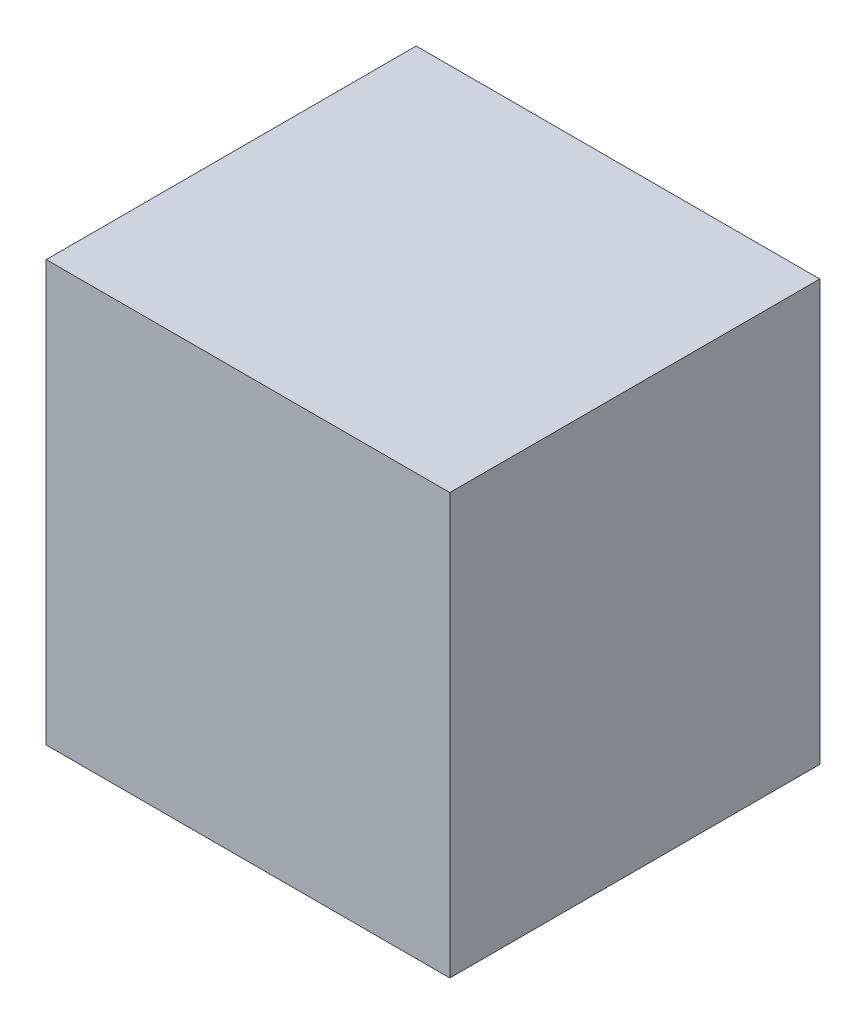
ISO-10303-21;
HEADER;
FILE_DESCRIPTION(('STEP AP214'),'2;1');
FILE_NAME('part.step','',(''),(''),'','','');
FILE_SCHEMA(('AUTOMOTIVE_DESIGN { 1 0 10303 214 1 1 1 1 }'));
ENDSEC;
DATA;
#1=APPLICATION_CONTEXT('core data for automotive mechanical design processes');
#2=APPLICATION_PROTOCOL_DEFINITION('international standard','automotive_design',2000,#1);
#3=PRODUCT_CONTEXT('',#1,'mechanical');
#4=PRODUCT('Part','Part','',(#3));
#5=PRODUCT_RELATED_PRODUCT_CATEGORY('part','',(#4));
#6=PRODUCT_DEFINITION_FORMATION('','',#4);
#7=PRODUCT_DEFINITION_CONTEXT('part definition',#1,'design');
#8=PRODUCT_DEFINITION('design','',#6,#7);
#9=PRODUCT_DEFINITION_SHAPE('','',#8);
#10=(LENGTH_UNIT() NAMED_UNIT(*) SI_UNIT(.MILLI.,.METRE.));
#11=(NAMED_UNIT(*) PLANE_ANGLE_UNIT() SI_UNIT($,.RADIAN.));
#12=(NAMED_UNIT(*) SI_UNIT($,.STERADIAN.) SOLID_ANGLE_UNIT());
#13=UNCERTAINTY_MEASURE_WITH_UNIT(LENGTH_MEASURE(1.E-05),#10,'distance_accuracy_value','');
#14=(GEOMETRIC_REPRESENTATION_CONTEXT(3) GLOBAL_UNCERTAINTY_ASSIGNED_CONTEXT((#13)) GLOBAL_UNIT_ASSIGNED_CONTEXT((#10,
#11,#12)) REPRESENTATION_CONTEXT('',''));
#15=CARTESIAN_POINT('',(0.,0.,0.));
#16=DIRECTION('',(0.,0.,1.));
#17=DIRECTION('',(1.,0.,0.));
#18=AXIS2_PLACEMENT_3D('',#15,#16,#17);
#19=CARTESIAN_POINT('',(0.,79.375,0.));
#20=DIRECTION('',(1.,0.,0.));
#21=DIRECTION('',(0.,0.,-1.));
#22=AXIS2_PLACEMENT_3D('',#19,#20,#21);
#23=PLANE('',#22);
#24=DIRECTION('',(0.,0.,1.));
#25=VECTOR('',#24,1.);
#26=CARTESIAN_POINT('',(0.,0.,0.));
#27=LINE('',#26,#25);
#28=CARTESIAN_POINT('',(0.,0.,-69.85));
#29=VERTEX_POINT('',#28);
#30=CARTESIAN_POINT('',(0.,0.,0.));
#31=VERTEX_POINT('',#30);
#32=EDGE_CURVE('E96',#29,#31,#27,.T.);
#33=ORIENTED_EDGE('',*,*,#32,.T.);
#34=DIRECTION('',(0.,-1.,0.));
#35=VECTOR('',#34,1.);
#36=CARTESIAN_POINT('',(0.,79.375,0.));
#37=LINE('',#36,#35);
#38=CARTESIAN_POINT('',(0.,79.375,0.));
#39=VERTEX_POINT('',#38);
#40=EDGE_CURVE('E11',#39,#31,#37,.T.);
#41=ORIENTED_EDGE('',*,*,#40,.F.);
#42=DIRECTION('',(0.,0.,1.));
#43=VECTOR('',#42,1.);
#44=CARTESIAN_POINT('',(0.,79.375,0.));
#45=LINE('',#44,#43);
#46=CARTESIAN_POINT('',(0.,79.375,-69.85));
#47=VERTEX_POINT('',#46);
#48=EDGE_CURVE('E84',#47,#39,#45,.T.);
#49=ORIENTED_EDGE('',*,*,#48,.F.);
#50=DIRECTION('',(0.,-1.,0.));
#51=VECTOR('',#50,1.);
#52=CARTESIAN_POINT('',(0.,79.375,-69.85));
#53=LINE('',#52,#51);
#54=EDGE_CURVE('E92',#47,#29,#53,.T.);
#55=ORIENTED_EDGE('',*,*,#54,.T.);
#56=EDGE_LOOP('',(#33,#41,#49,#55));
#57=FACE_BOUND('',#56,.T.);
#58=ADVANCED_FACE('F33',(#57),#23,.F.);
#59=CARTESIAN_POINT('',(0.,79.375,0.));
#60=DIRECTION('',(0.,0.,-1.));
#61=DIRECTION('',(-1.,0.,0.));
#62=AXIS2_PLACEMENT_3D('',#59,#60,#61);
#63=PLANE('',#62);
#64=DIRECTION('',(1.,0.,0.));
#65=VECTOR('',#64,1.);
#66=CARTESIAN_POINT('',(0.,0.,0.));
#67=LINE('',#66,#65);
#68=CARTESIAN_POINT('',(76.2,0.,0.));
#69=VERTEX_POINT('',#68);
#70=EDGE_CURVE('E88',#31,#69,#67,.T.);
#71=ORIENTED_EDGE('',*,*,#70,.T.);
#72=DIRECTION('',(0.,-1.,0.));
#73=VECTOR('',#72,1.);
#74=CARTESIAN_POINT('',(76.2,79.375,0.));
#75=LINE('',#74,#73);
#76=CARTESIAN_POINT('',(76.2,79.375,0.));
#77=VERTEX_POINT('',#76);
#78=EDGE_CURVE('E41',#77,#69,#75,.T.);
#79=ORIENTED_EDGE('',*,*,#78,.F.);
#80=DIRECTION('',(1.,0.,0.));
#81=VECTOR('',#80,1.);
#82=CARTESIAN_POINT('',(0.,79.375,0.));
#83=LINE('',#82,#81);
#84=EDGE_CURVE('E79',#39,#77,#83,.T.);
#85=ORIENTED_EDGE('',*,*,#84,.F.);
#86=ORIENTED_EDGE('',*,*,#40,.T.);
#87=EDGE_LOOP('',(#71,#79,#85,#86));
#88=FACE_BOUND('',#87,.T.);
#89=ADVANCED_FACE('F87',(#88),#63,.F.);
#90=CARTESIAN_POINT('',(76.2,79.375,0.));
#91=DIRECTION('',(-1.,0.,0.));
#92=DIRECTION('',(0.,0.,1.));
#93=AXIS2_PLACEMENT_3D('',#90,#91,#92);
#94=PLANE('',#93);
#95=DIRECTION('',(0.,0.,-1.));
#96=VECTOR('',#95,1.);
#97=CARTESIAN_POINT('',(76.2,0.,0.));
#98=LINE('',#97,#96);
#99=CARTESIAN_POINT('',(76.2,0.,-69.85));
#100=VERTEX_POINT('',#99);
#101=EDGE_CURVE('E66',#69,#100,#98,.T.);
#102=ORIENTED_EDGE('',*,*,#101,.T.);
#103=DIRECTION('',(0.,-1.,0.));
#104=VECTOR('',#103,1.);
#105=CARTESIAN_POINT('',(76.2,79.375,-69.85));
#106=LINE('',#105,#104);
#107=CARTESIAN_POINT('',(76.2,79.375,-69.85));
#108=VERTEX_POINT('',#107);
#109=EDGE_CURVE('E89',#108,#100,#106,.T.);
#110=ORIENTED_EDGE('',*,*,#109,.F.);
#111=DIRECTION('',(0.,0.,-1.));
#112=VECTOR('',#111,1.);
#113=CARTESIAN_POINT('',(76.2,79.375,0.));
#114=LINE('',#113,#112);
#115=EDGE_CURVE('E82',#77,#108,#114,.T.);
#116=ORIENTED_EDGE('',*,*,#115,.F.);
#117=ORIENTED_EDGE('',*,*,#78,.T.);
#118=EDGE_LOOP('',(#102,#110,#116,#117));
#119=FACE_BOUND('',#118,.T.);
#120=ADVANCED_FACE('F90',(#119),#94,.F.);
#121=CARTESIAN_POINT('',(0.,79.375,-69.85));
#122=DIRECTION('',(0.,0.,1.));
#123=DIRECTION('',(1.,0.,0.));
#124=AXIS2_PLACEMENT_3D('',#121,#122,#123);
#125=PLANE('',#124);
#126=DIRECTION('',(-1.,0.,0.));
#127=VECTOR('',#126,1.);
#128=CARTESIAN_POINT('',(0.,0.,-69.85));
#129=LINE('',#128,#127);
#130=EDGE_CURVE('E72',#100,#29,#129,.T.);
#131=ORIENTED_EDGE('',*,*,#130,.T.);
#132=ORIENTED_EDGE('',*,*,#54,.F.);
#133=DIRECTION('',(-1.,0.,0.));
#134=VECTOR('',#133,1.);
#135=CARTESIAN_POINT('',(0.,79.375,-69.85));
#136=LINE('',#135,#134);
#137=EDGE_CURVE('E49',#108,#47,#136,.T.);
#138=ORIENTED_EDGE('',*,*,#137,.F.);
#139=ORIENTED_EDGE('',*,*,#109,.T.);
#140=EDGE_LOOP('',(#131,#132,#138,#139));
#141=FACE_BOUND('',#140,.T.);
#142=ADVANCED_FACE('F103',(#141),#125,.F.);
#143=CARTESIAN_POINT('',(0.,79.375,0.));
#144=DIRECTION('',(0.,-1.,0.));
#145=DIRECTION('',(0.,0.,-1.));
#146=AXIS2_PLACEMENT_3D('',#143,#144,#145);
#147=PLANE('',#146);
#148=ORIENTED_EDGE('',*,*,#48,.T.);
#149=ORIENTED_EDGE('',*,*,#84,.T.);
#150=ORIENTED_EDGE('',*,*,#115,.T.);
#151=ORIENTED_EDGE('',*,*,#137,.T.);
#152=EDGE_LOOP('',(#148,#149,#150,#151));
#153=FACE_BOUND('',#152,.T.);
#154=ADVANCED_FACE('F80',(#153),#147,.F.);
#155=CARTESIAN_POINT('',(0.,0.,0.));
#156=DIRECTION('',(0.,-1.,0.));
#157=DIRECTION('',(0.,0.,-1.));
#158=AXIS2_PLACEMENT_3D('',#155,#156,#157);
#159=PLANE('',#158);
#160=ORIENTED_EDGE('',*,*,#32,.F.);
#161=ORIENTED_EDGE('',*,*,#130,.F.);
#162=ORIENTED_EDGE('',*,*,#101,.F.);
#163=ORIENTED_EDGE('',*,*,#70,.F.);
#164=EDGE_LOOP('',(#160,#161,#162,#163));
#165=FACE_BOUND('',#164,.T.);
#166=ADVANCED_FACE('F106',(#165),#159,.T.);
#167=CLOSED_SHELL('',(#58,#89,#120,#142,#154,#166));
#168=MANIFOLD_SOLID_BREP('B2',#167);
#169=ADVANCED_BREP_SHAPE_REPRESENTATION('',(#18,#168),#14);
#170=SHAPE_DEFINITION_REPRESENTATION(#9,#169);
ENDSEC;
END-ISO-10303-21;
